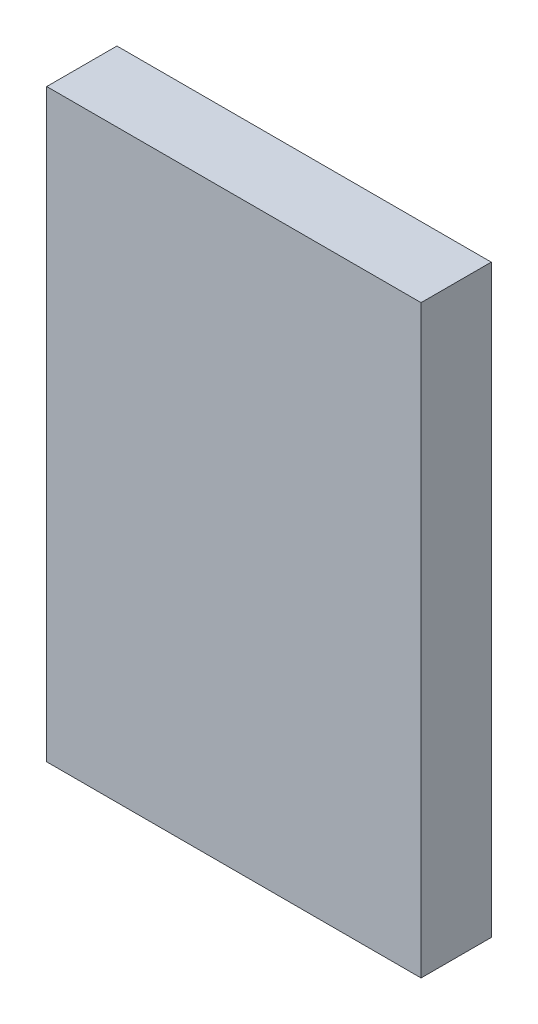
ISO-10303-21;
HEADER;
FILE_DESCRIPTION(('STEP AP214'),'2;1');
FILE_NAME('part.step','',(''),(''),'','','');
FILE_SCHEMA(('AUTOMOTIVE_DESIGN { 1 0 10303 214 1 1 1 1 }'));
ENDSEC;
DATA;
#1=APPLICATION_CONTEXT('core data for automotive mechanical design processes');
#2=APPLICATION_PROTOCOL_DEFINITION('international standard','automotive_design',2000,#1);
#3=PRODUCT_CONTEXT('',#1,'mechanical');
#4=PRODUCT('Part','Part','',(#3));
#5=PRODUCT_RELATED_PRODUCT_CATEGORY('part','',(#4));
#6=PRODUCT_DEFINITION_FORMATION('','',#4);
#7=PRODUCT_DEFINITION_CONTEXT('part definition',#1,'design');
#8=PRODUCT_DEFINITION('design','',#6,#7);
#9=PRODUCT_DEFINITION_SHAPE('','',#8);
#10=(LENGTH_UNIT() NAMED_UNIT(*) SI_UNIT(.MILLI.,.METRE.));
#11=(NAMED_UNIT(*) PLANE_ANGLE_UNIT() SI_UNIT($,.RADIAN.));
#12=(NAMED_UNIT(*) SI_UNIT($,.STERADIAN.) SOLID_ANGLE_UNIT());
#13=UNCERTAINTY_MEASURE_WITH_UNIT(LENGTH_MEASURE(1.E-05),#10,'distance_accuracy_value','');
#14=(GEOMETRIC_REPRESENTATION_CONTEXT(3) GLOBAL_UNCERTAINTY_ASSIGNED_CONTEXT((#13)) GLOBAL_UNIT_ASSIGNED_CONTEXT((#10,
#11,#12)) REPRESENTATION_CONTEXT('',''));
#15=CARTESIAN_POINT('',(0.,0.,0.));
#16=DIRECTION('',(0.,0.,1.));
#17=DIRECTION('',(1.,0.,0.));
#18=AXIS2_PLACEMENT_3D('',#15,#16,#17);
#19=CARTESIAN_POINT('',(-15.24,23.8125,5.715));
#20=DIRECTION('',(0.,-1.,0.));
#21=DIRECTION('',(0.,0.,-1.));
#22=AXIS2_PLACEMENT_3D('',#19,#20,#21);
#23=PLANE('',#22);
#24=DIRECTION('',(-1.,0.,0.));
#25=VECTOR('',#24,1.);
#26=CARTESIAN_POINT('',(-15.24,23.8125,0.));
#27=LINE('',#26,#25);
#28=CARTESIAN_POINT('',(15.24,23.8125,0.));
#29=VERTEX_POINT('',#28);
#30=CARTESIAN_POINT('',(-15.24,23.8125,0.));
#31=VERTEX_POINT('',#30);
#32=EDGE_CURVE('E114',#29,#31,#27,.T.);
#33=ORIENTED_EDGE('',*,*,#32,.T.);
#34=DIRECTION('',(0.,0.,-1.));
#35=VECTOR('',#34,1.);
#36=CARTESIAN_POINT('',(-15.24,23.8125,5.715));
#37=LINE('',#36,#35);
#38=CARTESIAN_POINT('',(-15.24,23.8125,5.715));
#39=VERTEX_POINT('',#38);
#40=EDGE_CURVE('E11',#39,#31,#37,.T.);
#41=ORIENTED_EDGE('',*,*,#40,.F.);
#42=DIRECTION('',(-1.,0.,0.));
#43=VECTOR('',#42,1.);
#44=CARTESIAN_POINT('',(-15.24,23.8125,5.715));
#45=LINE('',#44,#43);
#46=CARTESIAN_POINT('',(15.24,23.8125,5.715));
#47=VERTEX_POINT('',#46);
#48=EDGE_CURVE('E96',#47,#39,#45,.T.);
#49=ORIENTED_EDGE('',*,*,#48,.F.);
#50=DIRECTION('',(0.,0.,-1.));
#51=VECTOR('',#50,1.);
#52=CARTESIAN_POINT('',(15.24,23.8125,5.715));
#53=LINE('',#52,#51);
#54=EDGE_CURVE('E110',#47,#29,#53,.T.);
#55=ORIENTED_EDGE('',*,*,#54,.T.);
#56=EDGE_LOOP('',(#33,#41,#49,#55));
#57=FACE_BOUND('',#56,.T.);
#58=ADVANCED_FACE('F45',(#57),#23,.F.);
#59=CARTESIAN_POINT('',(-15.24,23.8125,5.715));
#60=DIRECTION('',(1.,0.,0.));
#61=DIRECTION('',(0.,0.,-1.));
#62=AXIS2_PLACEMENT_3D('',#59,#60,#61);
#63=PLANE('',#62);
#64=DIRECTION('',(0.,-1.,0.));
#65=VECTOR('',#64,1.);
#66=CARTESIAN_POINT('',(-15.24,23.8125,0.));
#67=LINE('',#66,#65);
#68=CARTESIAN_POINT('',(-15.24,-23.8125,0.));
#69=VERTEX_POINT('',#68);
#70=EDGE_CURVE('E102',#31,#69,#67,.T.);
#71=ORIENTED_EDGE('',*,*,#70,.T.);
#72=DIRECTION('',(0.,0.,-1.));
#73=VECTOR('',#72,1.);
#74=CARTESIAN_POINT('',(-15.24,-23.8125,5.715));
#75=LINE('',#74,#73);
#76=CARTESIAN_POINT('',(-15.24,-23.8125,5.715));
#77=VERTEX_POINT('',#76);
#78=EDGE_CURVE('E54',#77,#69,#75,.T.);
#79=ORIENTED_EDGE('',*,*,#78,.F.);
#80=DIRECTION('',(0.,-1.,0.));
#81=VECTOR('',#80,1.);
#82=CARTESIAN_POINT('',(-15.24,23.8125,5.715));
#83=LINE('',#82,#81);
#84=EDGE_CURVE('E90',#39,#77,#83,.T.);
#85=ORIENTED_EDGE('',*,*,#84,.F.);
#86=ORIENTED_EDGE('',*,*,#40,.T.);
#87=EDGE_LOOP('',(#71,#79,#85,#86));
#88=FACE_BOUND('',#87,.T.);
#89=ADVANCED_FACE('F101',(#88),#63,.F.);
#90=CARTESIAN_POINT('',(-15.24,-23.8125,5.715));
#91=DIRECTION('',(0.,1.,0.));
#92=DIRECTION('',(0.,0.,1.));
#93=AXIS2_PLACEMENT_3D('',#90,#91,#92);
#94=PLANE('',#93);
#95=DIRECTION('',(1.,0.,0.));
#96=VECTOR('',#95,1.);
#97=CARTESIAN_POINT('',(-15.24,-23.8125,0.));
#98=LINE('',#97,#96);
#99=CARTESIAN_POINT('',(15.24,-23.8125,0.));
#100=VERTEX_POINT('',#99);
#101=EDGE_CURVE('E120',#69,#100,#98,.T.);
#102=ORIENTED_EDGE('',*,*,#101,.T.);
#103=DIRECTION('',(0.,0.,-1.));
#104=VECTOR('',#103,1.);
#105=CARTESIAN_POINT('',(15.24,-23.8125,5.715));
#106=LINE('',#105,#104);
#107=CARTESIAN_POINT('',(15.24,-23.8125,5.715));
#108=VERTEX_POINT('',#107);
#109=EDGE_CURVE('E105',#108,#100,#106,.T.);
#110=ORIENTED_EDGE('',*,*,#109,.F.);
#111=DIRECTION('',(1.,0.,0.));
#112=VECTOR('',#111,1.);
#113=CARTESIAN_POINT('',(-15.24,-23.8125,5.715));
#114=LINE('',#113,#112);
#115=EDGE_CURVE('E93',#77,#108,#114,.T.);
#116=ORIENTED_EDGE('',*,*,#115,.F.);
#117=ORIENTED_EDGE('',*,*,#78,.T.);
#118=EDGE_LOOP('',(#102,#110,#116,#117));
#119=FACE_BOUND('',#118,.T.);
#120=ADVANCED_FACE('F106',(#119),#94,.F.);
#121=CARTESIAN_POINT('',(15.24,23.8125,5.715));
#122=DIRECTION('',(-1.,0.,0.));
#123=DIRECTION('',(0.,-1.,0.));
#124=AXIS2_PLACEMENT_3D('',#121,#122,#123);
#125=PLANE('',#124);
#126=DIRECTION('',(0.,1.,0.));
#127=VECTOR('',#126,1.);
#128=CARTESIAN_POINT('',(15.24,23.8125,0.));
#129=LINE('',#128,#127);
#130=EDGE_CURVE('E79',#100,#29,#129,.T.);
#131=ORIENTED_EDGE('',*,*,#130,.T.);
#132=ORIENTED_EDGE('',*,*,#54,.F.);
#133=DIRECTION('',(0.,1.,0.));
#134=VECTOR('',#133,1.);
#135=CARTESIAN_POINT('',(15.24,-23.8125,5.715));
#136=LINE('',#135,#134);
#137=EDGE_CURVE('E62',#108,#47,#136,.T.);
#138=ORIENTED_EDGE('',*,*,#137,.F.);
#139=ORIENTED_EDGE('',*,*,#109,.T.);
#140=EDGE_LOOP('',(#131,#132,#138,#139));
#141=FACE_BOUND('',#140,.T.);
#142=ADVANCED_FACE('F128',(#141),#125,.F.);
#143=CARTESIAN_POINT('',(0.,0.,5.715));
#144=DIRECTION('',(0.,0.,-1.));
#145=DIRECTION('',(-1.,0.,0.));
#146=AXIS2_PLACEMENT_3D('',#143,#144,#145);
#147=PLANE('',#146);
#148=ORIENTED_EDGE('',*,*,#48,.T.);
#149=ORIENTED_EDGE('',*,*,#84,.T.);
#150=ORIENTED_EDGE('',*,*,#115,.T.);
#151=ORIENTED_EDGE('',*,*,#137,.T.);
#152=EDGE_LOOP('',(#148,#149,#150,#151));
#153=FACE_BOUND('',#152,.T.);
#154=ADVANCED_FACE('F91',(#153),#147,.F.);
#155=CARTESIAN_POINT('',(0.,0.,0.));
#156=DIRECTION('',(0.,0.,-1.));
#157=DIRECTION('',(-1.,0.,0.));
#158=AXIS2_PLACEMENT_3D('',#155,#156,#157);
#159=PLANE('',#158);
#160=ORIENTED_EDGE('',*,*,#32,.F.);
#161=ORIENTED_EDGE('',*,*,#130,.F.);
#162=ORIENTED_EDGE('',*,*,#101,.F.);
#163=ORIENTED_EDGE('',*,*,#70,.F.);
#164=EDGE_LOOP('',(#160,#161,#162,#163));
#165=FACE_BOUND('',#164,.T.);
#166=ADVANCED_FACE('F131',(#165),#159,.T.);
#167=CLOSED_SHELL('',(#58,#89,#120,#142,#154,#166));
#168=MANIFOLD_SOLID_BREP('B2',#167);
#169=ADVANCED_BREP_SHAPE_REPRESENTATION('',(#18,#168),#14);
#170=SHAPE_DEFINITION_REPRESENTATION(#9,#169);
ENDSEC;
END-ISO-10303-21;
